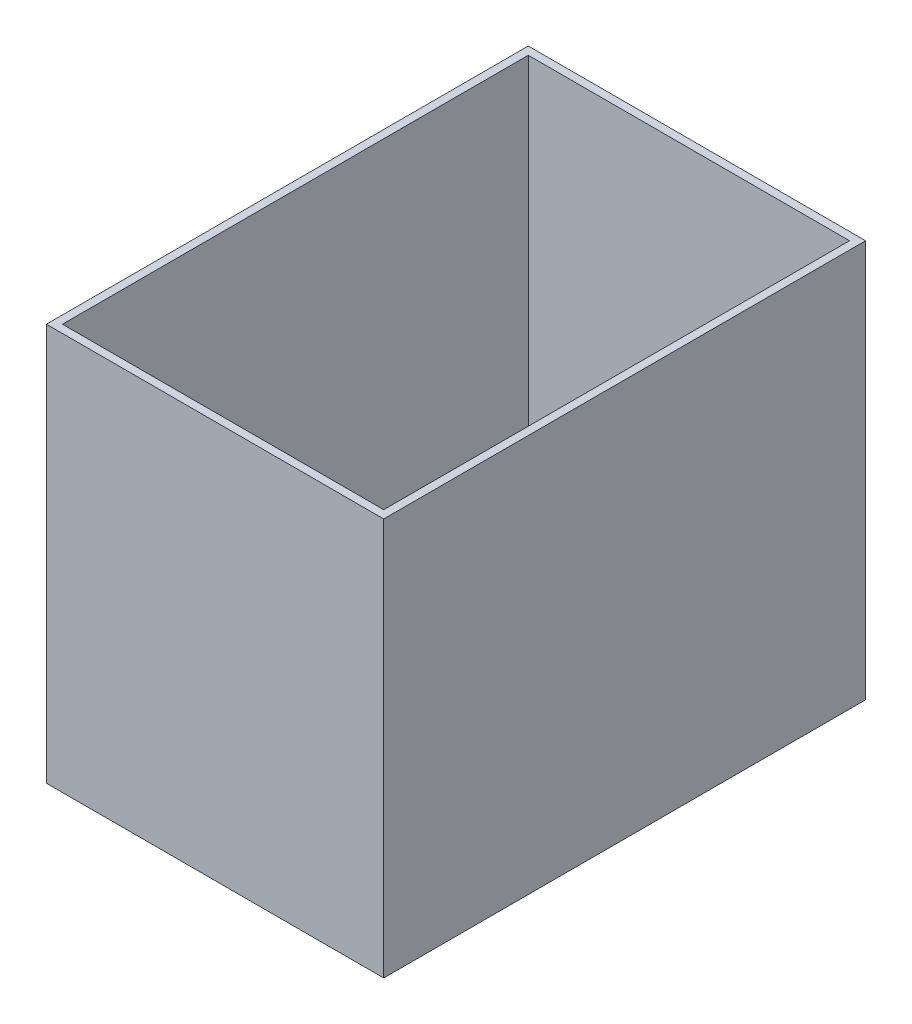
ISO-10303-21;
HEADER;
FILE_DESCRIPTION(('STEP AP214'),'2;1');
FILE_NAME('part.step','',(''),(''),'','','');
FILE_SCHEMA(('AUTOMOTIVE_DESIGN { 1 0 10303 214 1 1 1 1 }'));
ENDSEC;
DATA;
#1=APPLICATION_CONTEXT('core data for automotive mechanical design processes');
#2=APPLICATION_PROTOCOL_DEFINITION('international standard','automotive_design',2000,#1);
#3=PRODUCT_CONTEXT('',#1,'mechanical');
#4=PRODUCT('Part','Part','',(#3));
#5=PRODUCT_RELATED_PRODUCT_CATEGORY('part','',(#4));
#6=PRODUCT_DEFINITION_FORMATION('','',#4);
#7=PRODUCT_DEFINITION_CONTEXT('part definition',#1,'design');
#8=PRODUCT_DEFINITION('design','',#6,#7);
#9=PRODUCT_DEFINITION_SHAPE('','',#8);
#10=(LENGTH_UNIT() NAMED_UNIT(*) SI_UNIT(.MILLI.,.METRE.));
#11=(NAMED_UNIT(*) PLANE_ANGLE_UNIT() SI_UNIT($,.RADIAN.));
#12=(NAMED_UNIT(*) SI_UNIT($,.STERADIAN.) SOLID_ANGLE_UNIT());
#13=UNCERTAINTY_MEASURE_WITH_UNIT(LENGTH_MEASURE(1.E-05),#10,'distance_accuracy_value','');
#14=(GEOMETRIC_REPRESENTATION_CONTEXT(3) GLOBAL_UNCERTAINTY_ASSIGNED_CONTEXT((#13)) GLOBAL_UNIT_ASSIGNED_CONTEXT((#10,
#11,#12)) REPRESENTATION_CONTEXT('',''));
#15=CARTESIAN_POINT('',(0.,0.,0.));
#16=DIRECTION('',(0.,0.,1.));
#17=DIRECTION('',(1.,0.,0.));
#18=AXIS2_PLACEMENT_3D('',#15,#16,#17);
#19=CARTESIAN_POINT('',(0.,247.5,0.));
#20=DIRECTION('',(0.,1.,0.));
#21=DIRECTION('',(0.,0.,1.));
#22=AXIS2_PLACEMENT_3D('',#19,#20,#21);
#23=PLANE('',#22);
#24=DIRECTION('',(0.,0.,-1.));
#25=VECTOR('',#24,1.);
#26=CARTESIAN_POINT('',(105.,247.5,-150.));
#27=LINE('',#26,#25);
#28=CARTESIAN_POINT('',(105.,247.5,150.));
#29=VERTEX_POINT('',#28);
#30=CARTESIAN_POINT('',(105.,247.5,-150.));
#31=VERTEX_POINT('',#30);
#32=EDGE_CURVE('E136',#29,#31,#27,.T.);
#33=ORIENTED_EDGE('',*,*,#32,.T.);
#34=DIRECTION('',(-1.,0.,0.));
#35=VECTOR('',#34,1.);
#36=CARTESIAN_POINT('',(-105.,247.5,-150.));
#37=LINE('',#36,#35);
#38=CARTESIAN_POINT('',(-105.,247.5,-150.));
#39=VERTEX_POINT('',#38);
#40=EDGE_CURVE('E139',#31,#39,#37,.T.);
#41=ORIENTED_EDGE('',*,*,#40,.T.);
#42=DIRECTION('',(0.,0.,1.));
#43=VECTOR('',#42,1.);
#44=CARTESIAN_POINT('',(-105.,247.5,-150.));
#45=LINE('',#44,#43);
#46=CARTESIAN_POINT('',(-105.,247.5,150.));
#47=VERTEX_POINT('',#46);
#48=EDGE_CURVE('E142',#39,#47,#45,.T.);
#49=ORIENTED_EDGE('',*,*,#48,.T.);
#50=DIRECTION('',(1.,0.,0.));
#51=VECTOR('',#50,1.);
#52=CARTESIAN_POINT('',(-105.,247.5,150.));
#53=LINE('',#52,#51);
#54=EDGE_CURVE('E144',#47,#29,#53,.T.);
#55=ORIENTED_EDGE('',*,*,#54,.T.);
#56=EDGE_LOOP('',(#33,#41,#49,#55));
#57=FACE_BOUND('',#56,.T.);
#58=DIRECTION('',(1.,0.,0.));
#59=VECTOR('',#58,1.);
#60=CARTESIAN_POINT('',(100.,247.5,145.));
#61=LINE('',#60,#59);
#62=CARTESIAN_POINT('',(-100.,247.5,145.));
#63=VERTEX_POINT('',#62);
#64=CARTESIAN_POINT('',(100.,247.5,145.));
#65=VERTEX_POINT('',#64);
#66=EDGE_CURVE('E108',#63,#65,#61,.T.);
#67=ORIENTED_EDGE('',*,*,#66,.F.);
#68=DIRECTION('',(0.,0.,1.));
#69=VECTOR('',#68,1.);
#70=CARTESIAN_POINT('',(-100.,247.5,145.));
#71=LINE('',#70,#69);
#72=CARTESIAN_POINT('',(-100.,247.5,-145.));
#73=VERTEX_POINT('',#72);
#74=EDGE_CURVE('E100',#73,#63,#71,.T.);
#75=ORIENTED_EDGE('',*,*,#74,.F.);
#76=DIRECTION('',(-1.,0.,0.));
#77=VECTOR('',#76,1.);
#78=CARTESIAN_POINT('',(100.,247.5,-145.));
#79=LINE('',#78,#77);
#80=CARTESIAN_POINT('',(100.,247.5,-145.));
#81=VERTEX_POINT('',#80);
#82=EDGE_CURVE('E122',#81,#73,#79,.T.);
#83=ORIENTED_EDGE('',*,*,#82,.F.);
#84=DIRECTION('',(0.,0.,-1.));
#85=VECTOR('',#84,1.);
#86=CARTESIAN_POINT('',(100.,247.5,145.));
#87=LINE('',#86,#85);
#88=EDGE_CURVE('E120',#65,#81,#87,.T.);
#89=ORIENTED_EDGE('',*,*,#88,.F.);
#90=EDGE_LOOP('',(#67,#75,#83,#89));
#91=FACE_BOUND('',#90,.T.);
#92=ADVANCED_FACE('F35',(#57,#91),#23,.T.);
#93=CARTESIAN_POINT('',(0.,0.,0.));
#94=DIRECTION('',(0.,1.,0.));
#95=DIRECTION('',(0.,0.,1.));
#96=AXIS2_PLACEMENT_3D('',#93,#94,#95);
#97=PLANE('',#96);
#98=DIRECTION('',(0.,0.,-1.));
#99=VECTOR('',#98,1.);
#100=CARTESIAN_POINT('',(105.,0.,-150.));
#101=LINE('',#100,#99);
#102=CARTESIAN_POINT('',(105.,0.,150.));
#103=VERTEX_POINT('',#102);
#104=CARTESIAN_POINT('',(105.,0.,-150.));
#105=VERTEX_POINT('',#104);
#106=EDGE_CURVE('E116',#103,#105,#101,.T.);
#107=ORIENTED_EDGE('',*,*,#106,.F.);
#108=DIRECTION('',(1.,0.,0.));
#109=VECTOR('',#108,1.);
#110=CARTESIAN_POINT('',(-105.,0.,150.));
#111=LINE('',#110,#109);
#112=CARTESIAN_POINT('',(-105.,0.,150.));
#113=VERTEX_POINT('',#112);
#114=EDGE_CURVE('E140',#113,#103,#111,.T.);
#115=ORIENTED_EDGE('',*,*,#114,.F.);
#116=DIRECTION('',(0.,0.,1.));
#117=VECTOR('',#116,1.);
#118=CARTESIAN_POINT('',(-105.,0.,-150.));
#119=LINE('',#118,#117);
#120=CARTESIAN_POINT('',(-105.,0.,-150.));
#121=VERTEX_POINT('',#120);
#122=EDGE_CURVE('E151',#121,#113,#119,.T.);
#123=ORIENTED_EDGE('',*,*,#122,.F.);
#124=DIRECTION('',(-1.,0.,0.));
#125=VECTOR('',#124,1.);
#126=CARTESIAN_POINT('',(-105.,0.,-150.));
#127=LINE('',#126,#125);
#128=EDGE_CURVE('E149',#105,#121,#127,.T.);
#129=ORIENTED_EDGE('',*,*,#128,.F.);
#130=EDGE_LOOP('',(#107,#115,#123,#129));
#131=FACE_BOUND('',#130,.T.);
#132=DIRECTION('',(0.,0.,1.));
#133=VECTOR('',#132,1.);
#134=CARTESIAN_POINT('',(-100.,0.,145.));
#135=LINE('',#134,#133);
#136=CARTESIAN_POINT('',(-100.,0.,-145.));
#137=VERTEX_POINT('',#136);
#138=CARTESIAN_POINT('',(-100.,0.,145.));
#139=VERTEX_POINT('',#138);
#140=EDGE_CURVE('E58',#137,#139,#135,.T.);
#141=ORIENTED_EDGE('',*,*,#140,.T.);
#142=DIRECTION('',(1.,0.,0.));
#143=VECTOR('',#142,1.);
#144=CARTESIAN_POINT('',(100.,0.,145.));
#145=LINE('',#144,#143);
#146=CARTESIAN_POINT('',(100.,0.,145.));
#147=VERTEX_POINT('',#146);
#148=EDGE_CURVE('E115',#139,#147,#145,.T.);
#149=ORIENTED_EDGE('',*,*,#148,.T.);
#150=DIRECTION('',(0.,0.,-1.));
#151=VECTOR('',#150,1.);
#152=CARTESIAN_POINT('',(100.,0.,145.));
#153=LINE('',#152,#151);
#154=CARTESIAN_POINT('',(100.,0.,-145.));
#155=VERTEX_POINT('',#154);
#156=EDGE_CURVE('E128',#147,#155,#153,.T.);
#157=ORIENTED_EDGE('',*,*,#156,.T.);
#158=DIRECTION('',(-1.,0.,0.));
#159=VECTOR('',#158,1.);
#160=CARTESIAN_POINT('',(100.,0.,-145.));
#161=LINE('',#160,#159);
#162=EDGE_CURVE('E109',#155,#137,#161,.T.);
#163=ORIENTED_EDGE('',*,*,#162,.T.);
#164=EDGE_LOOP('',(#141,#149,#157,#163));
#165=FACE_BOUND('',#164,.T.);
#166=ADVANCED_FACE('F169',(#131,#165),#97,.F.);
#167=CARTESIAN_POINT('',(105.,247.5,-150.));
#168=DIRECTION('',(-1.,0.,0.));
#169=DIRECTION('',(0.,0.,1.));
#170=AXIS2_PLACEMENT_3D('',#167,#168,#169);
#171=PLANE('',#170);
#172=ORIENTED_EDGE('',*,*,#106,.T.);
#173=DIRECTION('',(0.,-1.,0.));
#174=VECTOR('',#173,1.);
#175=CARTESIAN_POINT('',(105.,247.5,-150.));
#176=LINE('',#175,#174);
#177=EDGE_CURVE('E11',#31,#105,#176,.T.);
#178=ORIENTED_EDGE('',*,*,#177,.F.);
#179=ORIENTED_EDGE('',*,*,#32,.F.);
#180=DIRECTION('',(0.,-1.,0.));
#181=VECTOR('',#180,1.);
#182=CARTESIAN_POINT('',(105.,247.5,150.));
#183=LINE('',#182,#181);
#184=EDGE_CURVE('E146',#29,#103,#183,.T.);
#185=ORIENTED_EDGE('',*,*,#184,.T.);
#186=EDGE_LOOP('',(#172,#178,#179,#185));
#187=FACE_BOUND('',#186,.T.);
#188=ADVANCED_FACE('F37',(#187),#171,.F.);
#189=CARTESIAN_POINT('',(-105.,247.5,-150.));
#190=DIRECTION('',(0.,0.,1.));
#191=DIRECTION('',(1.,0.,0.));
#192=AXIS2_PLACEMENT_3D('',#189,#190,#191);
#193=PLANE('',#192);
#194=ORIENTED_EDGE('',*,*,#128,.T.);
#195=DIRECTION('',(0.,-1.,0.));
#196=VECTOR('',#195,1.);
#197=CARTESIAN_POINT('',(-105.,247.5,-150.));
#198=LINE('',#197,#196);
#199=EDGE_CURVE('E43',#39,#121,#198,.T.);
#200=ORIENTED_EDGE('',*,*,#199,.F.);
#201=ORIENTED_EDGE('',*,*,#40,.F.);
#202=ORIENTED_EDGE('',*,*,#177,.T.);
#203=EDGE_LOOP('',(#194,#200,#201,#202));
#204=FACE_BOUND('',#203,.T.);
#205=ADVANCED_FACE('F179',(#204),#193,.F.);
#206=CARTESIAN_POINT('',(-105.,247.5,-150.));
#207=DIRECTION('',(1.,0.,0.));
#208=DIRECTION('',(0.,0.,-1.));
#209=AXIS2_PLACEMENT_3D('',#206,#207,#208);
#210=PLANE('',#209);
#211=ORIENTED_EDGE('',*,*,#122,.T.);
#212=DIRECTION('',(0.,-1.,0.));
#213=VECTOR('',#212,1.);
#214=CARTESIAN_POINT('',(-105.,247.5,150.));
#215=LINE('',#214,#213);
#216=EDGE_CURVE('E156',#47,#113,#215,.T.);
#217=ORIENTED_EDGE('',*,*,#216,.F.);
#218=ORIENTED_EDGE('',*,*,#48,.F.);
#219=ORIENTED_EDGE('',*,*,#199,.T.);
#220=EDGE_LOOP('',(#211,#217,#218,#219));
#221=FACE_BOUND('',#220,.T.);
#222=ADVANCED_FACE('F163',(#221),#210,.F.);
#223=CARTESIAN_POINT('',(-105.,247.5,150.));
#224=DIRECTION('',(0.,0.,-1.));
#225=DIRECTION('',(-1.,0.,0.));
#226=AXIS2_PLACEMENT_3D('',#223,#224,#225);
#227=PLANE('',#226);
#228=ORIENTED_EDGE('',*,*,#114,.T.);
#229=ORIENTED_EDGE('',*,*,#184,.F.);
#230=ORIENTED_EDGE('',*,*,#54,.F.);
#231=ORIENTED_EDGE('',*,*,#216,.T.);
#232=EDGE_LOOP('',(#228,#229,#230,#231));
#233=FACE_BOUND('',#232,.T.);
#234=ADVANCED_FACE('F173',(#233),#227,.F.);
#235=CARTESIAN_POINT('',(-100.,247.5,145.));
#236=DIRECTION('',(1.,0.,0.));
#237=DIRECTION('',(0.,0.,-1.));
#238=AXIS2_PLACEMENT_3D('',#235,#236,#237);
#239=PLANE('',#238);
#240=ORIENTED_EDGE('',*,*,#140,.F.);
#241=DIRECTION('',(0.,-1.,0.));
#242=VECTOR('',#241,1.);
#243=CARTESIAN_POINT('',(-100.,247.5,-145.));
#244=LINE('',#243,#242);
#245=EDGE_CURVE('E104',#73,#137,#244,.T.);
#246=ORIENTED_EDGE('',*,*,#245,.F.);
#247=ORIENTED_EDGE('',*,*,#74,.T.);
#248=DIRECTION('',(0.,-1.,0.));
#249=VECTOR('',#248,1.);
#250=CARTESIAN_POINT('',(-100.,247.5,145.));
#251=LINE('',#250,#249);
#252=EDGE_CURVE('E103',#63,#139,#251,.T.);
#253=ORIENTED_EDGE('',*,*,#252,.T.);
#254=EDGE_LOOP('',(#240,#246,#247,#253));
#255=FACE_BOUND('',#254,.T.);
#256=ADVANCED_FACE('F102',(#255),#239,.T.);
#257=CARTESIAN_POINT('',(100.,247.5,145.));
#258=DIRECTION('',(0.,0.,-1.));
#259=DIRECTION('',(-1.,0.,0.));
#260=AXIS2_PLACEMENT_3D('',#257,#258,#259);
#261=PLANE('',#260);
#262=ORIENTED_EDGE('',*,*,#148,.F.);
#263=ORIENTED_EDGE('',*,*,#252,.F.);
#264=ORIENTED_EDGE('',*,*,#66,.T.);
#265=DIRECTION('',(0.,-1.,0.));
#266=VECTOR('',#265,1.);
#267=CARTESIAN_POINT('',(100.,247.5,145.));
#268=LINE('',#267,#266);
#269=EDGE_CURVE('E117',#65,#147,#268,.T.);
#270=ORIENTED_EDGE('',*,*,#269,.T.);
#271=EDGE_LOOP('',(#262,#263,#264,#270));
#272=FACE_BOUND('',#271,.T.);
#273=ADVANCED_FACE('F112',(#272),#261,.T.);
#274=CARTESIAN_POINT('',(100.,247.5,145.));
#275=DIRECTION('',(-1.,0.,0.));
#276=DIRECTION('',(0.,0.,1.));
#277=AXIS2_PLACEMENT_3D('',#274,#275,#276);
#278=PLANE('',#277);
#279=ORIENTED_EDGE('',*,*,#156,.F.);
#280=ORIENTED_EDGE('',*,*,#269,.F.);
#281=ORIENTED_EDGE('',*,*,#88,.T.);
#282=DIRECTION('',(0.,-1.,0.));
#283=VECTOR('',#282,1.);
#284=CARTESIAN_POINT('',(100.,247.5,-145.));
#285=LINE('',#284,#283);
#286=EDGE_CURVE('E50',#81,#155,#285,.T.);
#287=ORIENTED_EDGE('',*,*,#286,.T.);
#288=EDGE_LOOP('',(#279,#280,#281,#287));
#289=FACE_BOUND('',#288,.T.);
#290=ADVANCED_FACE('F202',(#289),#278,.T.);
#291=CARTESIAN_POINT('',(100.,247.5,-145.));
#292=DIRECTION('',(0.,0.,1.));
#293=DIRECTION('',(1.,0.,0.));
#294=AXIS2_PLACEMENT_3D('',#291,#292,#293);
#295=PLANE('',#294);
#296=ORIENTED_EDGE('',*,*,#162,.F.);
#297=ORIENTED_EDGE('',*,*,#286,.F.);
#298=ORIENTED_EDGE('',*,*,#82,.T.);
#299=ORIENTED_EDGE('',*,*,#245,.T.);
#300=EDGE_LOOP('',(#296,#297,#298,#299));
#301=FACE_BOUND('',#300,.T.);
#302=ADVANCED_FACE('F206',(#301),#295,.T.);
#303=CLOSED_SHELL('',(#92,#166,#188,#205,#222,#234,#256,#273,#290,#302));
#304=MANIFOLD_SOLID_BREP('B2',#303);
#305=ADVANCED_BREP_SHAPE_REPRESENTATION('',(#18,#304),#14);
#306=SHAPE_DEFINITION_REPRESENTATION(#9,#305);
ENDSEC;
END-ISO-10303-21;
